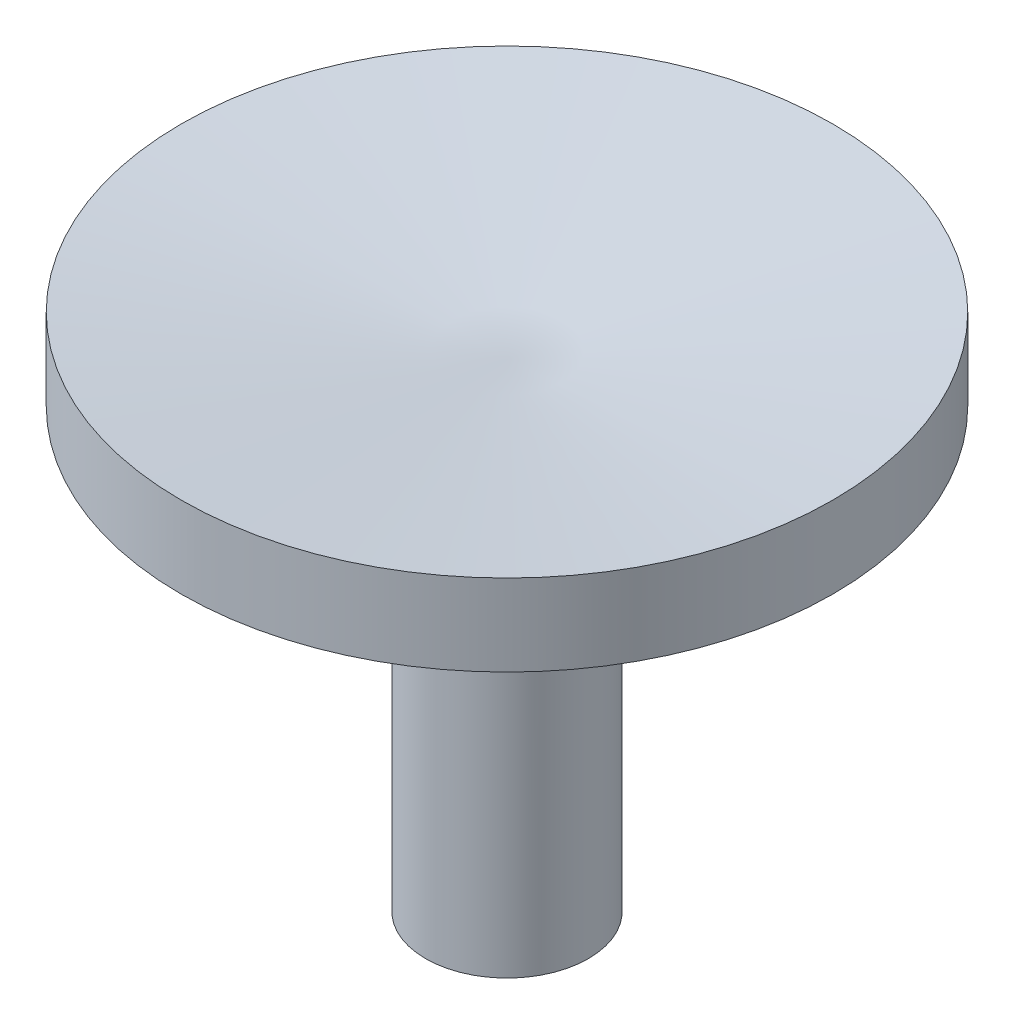
ISO-10303-21;
HEADER;
FILE_DESCRIPTION(('STEP AP214'),'2;1');
FILE_NAME('part.step','',(''),(''),'','','');
FILE_SCHEMA(('AUTOMOTIVE_DESIGN { 1 0 10303 214 1 1 1 1 }'));
ENDSEC;
DATA;
#1=APPLICATION_CONTEXT('core data for automotive mechanical design processes');
#2=APPLICATION_PROTOCOL_DEFINITION('international standard','automotive_design',2000,#1);
#3=PRODUCT_CONTEXT('',#1,'mechanical');
#4=PRODUCT('Part','Part','',(#3));
#5=PRODUCT_RELATED_PRODUCT_CATEGORY('part','',(#4));
#6=PRODUCT_DEFINITION_FORMATION('','',#4);
#7=PRODUCT_DEFINITION_CONTEXT('part definition',#1,'design');
#8=PRODUCT_DEFINITION('design','',#6,#7);
#9=PRODUCT_DEFINITION_SHAPE('','',#8);
#10=(LENGTH_UNIT() NAMED_UNIT(*) SI_UNIT(.MILLI.,.METRE.));
#11=(NAMED_UNIT(*) PLANE_ANGLE_UNIT() SI_UNIT($,.RADIAN.));
#12=(NAMED_UNIT(*) SI_UNIT($,.STERADIAN.) SOLID_ANGLE_UNIT());
#13=UNCERTAINTY_MEASURE_WITH_UNIT(LENGTH_MEASURE(1.E-05),#10,'distance_accuracy_value','');
#14=(GEOMETRIC_REPRESENTATION_CONTEXT(3) GLOBAL_UNCERTAINTY_ASSIGNED_CONTEXT((#13)) GLOBAL_UNIT_ASSIGNED_CONTEXT((#10,
#11,#12)) REPRESENTATION_CONTEXT('',''));
#15=CARTESIAN_POINT('',(0.,0.,0.));
#16=DIRECTION('',(0.,0.,1.));
#17=DIRECTION('',(1.,0.,0.));
#18=AXIS2_PLACEMENT_3D('',#15,#16,#17);
#19=CARTESIAN_POINT('',(0.,1.375,0.));
#20=DIRECTION('',(0.,1.,0.));
#21=DIRECTION('',(0.,0.,1.));
#22=AXIS2_PLACEMENT_3D('',#19,#20,#21);
#23=CONICAL_SURFACE('',#22,4.,1.44644133224814);
#24=CARTESIAN_POINT('',(0.,0.875,0.));
#25=VERTEX_POINT('',#24);
#26=VERTEX_LOOP('',#25);
#27=FACE_BOUND('',#26,.T.);
#28=CARTESIAN_POINT('',(0.,1.375,0.));
#29=DIRECTION('',(0.,-1.,0.));
#30=DIRECTION('',(0.,0.,-1.));
#31=AXIS2_PLACEMENT_3D('',#28,#29,#30);
#32=CIRCLE('',#31,4.);
#33=CARTESIAN_POINT('',(0.,1.375,-4.));
#34=VERTEX_POINT('',#33);
#35=EDGE_CURVE('E11',#34,#34,#32,.T.);
#36=ORIENTED_EDGE('',*,*,#35,.F.);
#37=EDGE_LOOP('',(#36));
#38=FACE_BOUND('',#37,.T.);
#39=ADVANCED_FACE('F35',(#27,#38),#23,.F.);
#40=CARTESIAN_POINT('',(0.,0.,0.));
#41=DIRECTION('',(0.,-1.,0.));
#42=DIRECTION('',(0.,0.,-1.));
#43=AXIS2_PLACEMENT_3D('',#40,#41,#42);
#44=CYLINDRICAL_SURFACE('',#43,4.);
#45=ORIENTED_EDGE('',*,*,#35,.T.);
#46=EDGE_LOOP('',(#45));
#47=FACE_BOUND('',#46,.T.);
#48=CARTESIAN_POINT('',(0.,0.375,0.));
#49=DIRECTION('',(0.,-1.,0.));
#50=DIRECTION('',(0.,0.,-1.));
#51=AXIS2_PLACEMENT_3D('',#48,#49,#50);
#52=CIRCLE('',#51,4.);
#53=CARTESIAN_POINT('',(0.,0.375,4.));
#54=VERTEX_POINT('',#53);
#55=EDGE_CURVE('E41',#54,#54,#52,.T.);
#56=ORIENTED_EDGE('',*,*,#55,.F.);
#57=EDGE_LOOP('',(#56));
#58=FACE_BOUND('',#57,.T.);
#59=ADVANCED_FACE('F46',(#47,#58),#44,.T.);
#60=CARTESIAN_POINT('',(0.,0.,0.));
#61=DIRECTION('',(0.,1.,0.));
#62=DIRECTION('',(0.,0.,1.));
#63=AXIS2_PLACEMENT_3D('',#60,#61,#62);
#64=CONICAL_SURFACE('',#63,1.,1.44644133224814);
#65=CARTESIAN_POINT('',(0.,0.,0.));
#66=DIRECTION('',(0.,-1.,0.));
#67=DIRECTION('',(0.,0.,-1.));
#68=AXIS2_PLACEMENT_3D('',#65,#66,#67);
#69=CIRCLE('',#68,1.);
#70=CARTESIAN_POINT('',(0.,0.,1.));
#71=VERTEX_POINT('',#70);
#72=EDGE_CURVE('E55',#71,#71,#69,.T.);
#73=CARTESIAN_POINT('',(0.,0.375,4.));
#74=CARTESIAN_POINT('',(0.,0.37109375,3.96875));
#75=CARTESIAN_POINT('',(0.,0.3671875,3.9375));
#76=CARTESIAN_POINT('',(0.,0.359375,3.875));
#77=CARTESIAN_POINT('',(0.,0.35546875,3.84375));
#78=CARTESIAN_POINT('',(0.,0.34765625,3.78125));
#79=CARTESIAN_POINT('',(0.,0.34375,3.75));
#80=CARTESIAN_POINT('',(0.,0.3359375,3.6875));
#81=CARTESIAN_POINT('',(0.,0.33203125,3.65625));
#82=CARTESIAN_POINT('',(0.,0.32421875,3.59375));
#83=CARTESIAN_POINT('',(0.,0.3203125,3.5625));
#84=CARTESIAN_POINT('',(0.,0.3125,3.5));
#85=CARTESIAN_POINT('',(0.,0.30859375,3.46875));
#86=CARTESIAN_POINT('',(0.,0.30078125,3.40625));
#87=CARTESIAN_POINT('',(0.,0.296875,3.375));
#88=CARTESIAN_POINT('',(0.,0.2890625,3.3125));
#89=CARTESIAN_POINT('',(0.,0.28515625,3.28125));
#90=CARTESIAN_POINT('',(0.,0.27734375,3.21875));
#91=CARTESIAN_POINT('',(0.,0.2734375,3.1875));
#92=CARTESIAN_POINT('',(0.,0.265625,3.125));
#93=CARTESIAN_POINT('',(0.,0.26171875,3.09375));
#94=CARTESIAN_POINT('',(0.,0.25390625,3.03125));
#95=CARTESIAN_POINT('',(0.,0.25,3.));
#96=CARTESIAN_POINT('',(0.,0.2421875,2.9375));
#97=CARTESIAN_POINT('',(0.,0.23828125,2.90625));
#98=CARTESIAN_POINT('',(0.,0.23046875,2.84375));
#99=CARTESIAN_POINT('',(0.,0.2265625,2.8125));
#100=CARTESIAN_POINT('',(0.,0.21875,2.75));
#101=CARTESIAN_POINT('',(0.,0.21484375,2.71875));
#102=CARTESIAN_POINT('',(0.,0.20703125,2.65625));
#103=CARTESIAN_POINT('',(0.,0.203125,2.625));
#104=CARTESIAN_POINT('',(0.,0.1953125,2.5625));
#105=CARTESIAN_POINT('',(0.,0.19140625,2.53125));
#106=CARTESIAN_POINT('',(0.,0.18359375,2.46875));
#107=CARTESIAN_POINT('',(0.,0.1796875,2.4375));
#108=CARTESIAN_POINT('',(0.,0.171875,2.375));
#109=CARTESIAN_POINT('',(0.,0.16796875,2.34375));
#110=CARTESIAN_POINT('',(0.,0.16015625,2.28125));
#111=CARTESIAN_POINT('',(0.,0.15625,2.25));
#112=CARTESIAN_POINT('',(0.,0.1484375,2.1875));
#113=CARTESIAN_POINT('',(0.,0.14453125,2.15625));
#114=CARTESIAN_POINT('',(0.,0.13671875,2.09375));
#115=CARTESIAN_POINT('',(0.,0.1328125,2.0625));
#116=CARTESIAN_POINT('',(0.,0.125,2.));
#117=CARTESIAN_POINT('',(0.,0.12109375,1.96875));
#118=CARTESIAN_POINT('',(0.,0.11328125,1.90625));
#119=CARTESIAN_POINT('',(0.,0.109375,1.875));
#120=CARTESIAN_POINT('',(0.,0.1015625,1.8125));
#121=CARTESIAN_POINT('',(0.,0.0976562500000001,1.78125));
#122=CARTESIAN_POINT('',(0.,0.0898437500000001,1.71875));
#123=CARTESIAN_POINT('',(0.,0.0859375000000001,1.6875));
#124=CARTESIAN_POINT('',(0.,0.0781250000000001,1.625));
#125=CARTESIAN_POINT('',(0.,0.0742187500000001,1.59375));
#126=CARTESIAN_POINT('',(0.,0.0664062500000001,1.53125));
#127=CARTESIAN_POINT('',(0.,0.0625000000000001,1.5));
#128=CARTESIAN_POINT('',(0.,0.0546875,1.4375));
#129=CARTESIAN_POINT('',(0.,0.05078125,1.40625));
#130=CARTESIAN_POINT('',(0.,0.04296875,1.34375));
#131=CARTESIAN_POINT('',(0.,0.0390625,1.3125));
#132=CARTESIAN_POINT('',(0.,0.03125,1.25));
#133=CARTESIAN_POINT('',(0.,0.02734375,1.21875));
#134=CARTESIAN_POINT('',(0.,0.01953125,1.15625));
#135=CARTESIAN_POINT('',(0.,0.015625,1.125));
#136=CARTESIAN_POINT('',(0.,0.0078125,1.0625));
#137=CARTESIAN_POINT('',(0.,0.00390624999999999,1.03125));
#138=CARTESIAN_POINT('',(0.,0.,1.));
#139=B_SPLINE_CURVE_WITH_KNOTS('',3,(#73,#74,#75,#76,#77,#78,#79,#80,#81,#82,#83,#84,#85,#86,
#87,#88,#89,#90,#91,#92,#93,#94,#95,#96,#97,#98,#99,#100,#101,#102,#103,#104,#105,#106,#107,
#108,#109,#110,#111,#112,#113,#114,#115,#116,#117,#118,#119,#120,#121,#122,#123,#124,#125,#126,
#127,#128,#129,#130,#131,#132,#133,#134,#135,#136,#137,#138),.UNSPECIFIED.,.F.,.F.,(4,2,2,2,2,2,
2,2,2,2,2,2,2,2,2,2,2,2,2,2,2,2,2,2,2,2,2,2,2,2,2,2,4),(0.,0.0944795829878737,0.188959165975747,
0.283438748963621,0.377918331951494,0.472397914939368,0.566877497927241,0.661357080915115,
0.755836663902989,0.850316246890862,0.944795829878736,1.03927541286661,1.13375499585448,
1.22823457884236,1.32271416183023,1.4171937448181,1.51167332780598,1.60615291079385,
1.70063249378172,1.7951120767696,1.88959165975747,1.98407124274535,2.07855082573322,
2.17303040872109,2.26750999170897,2.36198957469684,2.45646915768471,2.55094874067259,
2.64542832366046,2.73990790664834,2.83438748963621,2.92886707262408,3.02334665561196),.UNSPECIFIED.);
#140=EDGE_CURVE('BSEAM51',#54,#71,#139,.T.);
#141=ORIENTED_EDGE('',*,*,#55,.T.);
#142=ORIENTED_EDGE('',*,*,#72,.F.);
#143=ORIENTED_EDGE('',*,*,#140,.T.);
#144=ORIENTED_EDGE('',*,*,#140,.F.);
#145=EDGE_LOOP('',(#141,#143,#142,#144));
#146=FACE_BOUND('',#145,.T.);
#147=ADVANCED_FACE('F51',(#146),#64,.T.);
#148=CARTESIAN_POINT('',(0.,-5.,0.));
#149=DIRECTION('',(0.,1.,0.));
#150=DIRECTION('',(0.,0.,1.));
#151=AXIS2_PLACEMENT_3D('',#148,#149,#150);
#152=CYLINDRICAL_SURFACE('',#151,1.);
#153=CARTESIAN_POINT('',(0.,-5.,0.));
#154=DIRECTION('',(0.,-1.,0.));
#155=DIRECTION('',(0.,0.,-1.));
#156=AXIS2_PLACEMENT_3D('',#153,#154,#155);
#157=CIRCLE('',#156,1.);
#158=CARTESIAN_POINT('',(0.,-5.,-1.));
#159=VERTEX_POINT('',#158);
#160=EDGE_CURVE('E57',#159,#159,#157,.T.);
#161=ORIENTED_EDGE('',*,*,#160,.F.);
#162=EDGE_LOOP('',(#161));
#163=FACE_BOUND('',#162,.T.);
#164=ORIENTED_EDGE('',*,*,#72,.T.);
#165=EDGE_LOOP('',(#164));
#166=FACE_BOUND('',#165,.T.);
#167=ADVANCED_FACE('F65',(#163,#166),#152,.T.);
#168=CARTESIAN_POINT('',(0.,-5.,0.));
#169=DIRECTION('',(0.,-1.,0.));
#170=DIRECTION('',(0.,0.,-1.));
#171=AXIS2_PLACEMENT_3D('',#168,#169,#170);
#172=PLANE('',#171);
#173=ORIENTED_EDGE('',*,*,#160,.T.);
#174=EDGE_LOOP('',(#173));
#175=FACE_BOUND('',#174,.T.);
#176=ADVANCED_FACE('F63',(#175),#172,.T.);
#177=CLOSED_SHELL('',(#39,#59,#147,#167,#176));
#178=MANIFOLD_SOLID_BREP('B2',#177);
#179=ADVANCED_BREP_SHAPE_REPRESENTATION('',(#18,#178),#14);
#180=SHAPE_DEFINITION_REPRESENTATION(#9,#179);
ENDSEC;
END-ISO-10303-21;
